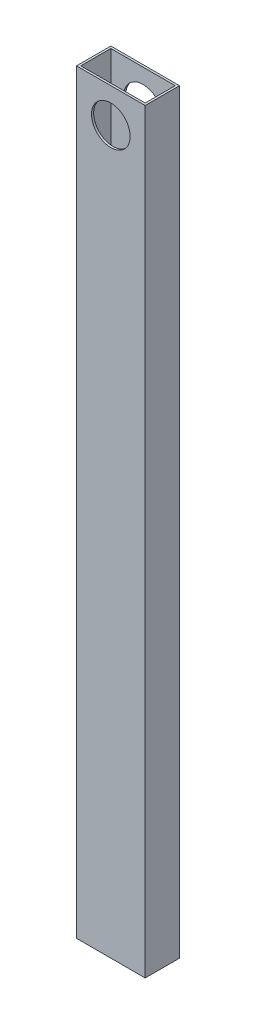
ISO-10303-21;
HEADER;
FILE_DESCRIPTION(('STEP AP214'),'2;1');
FILE_NAME('part.step','',(''),(''),'','','');
FILE_SCHEMA(('AUTOMOTIVE_DESIGN { 1 0 10303 214 1 1 1 1 }'));
ENDSEC;
DATA;
#1=APPLICATION_CONTEXT('core data for automotive mechanical design processes');
#2=APPLICATION_PROTOCOL_DEFINITION('international standard','automotive_design',2000,#1);
#3=PRODUCT_CONTEXT('',#1,'mechanical');
#4=PRODUCT('Part','Part','',(#3));
#5=PRODUCT_RELATED_PRODUCT_CATEGORY('part','',(#4));
#6=PRODUCT_DEFINITION_FORMATION('','',#4);
#7=PRODUCT_DEFINITION_CONTEXT('part definition',#1,'design');
#8=PRODUCT_DEFINITION('design','',#6,#7);
#9=PRODUCT_DEFINITION_SHAPE('','',#8);
#10=(LENGTH_UNIT() NAMED_UNIT(*) SI_UNIT(.MILLI.,.METRE.));
#11=(NAMED_UNIT(*) PLANE_ANGLE_UNIT() SI_UNIT($,.RADIAN.));
#12=(NAMED_UNIT(*) SI_UNIT($,.STERADIAN.) SOLID_ANGLE_UNIT());
#13=UNCERTAINTY_MEASURE_WITH_UNIT(LENGTH_MEASURE(1.E-05),#10,'distance_accuracy_value','');
#14=(GEOMETRIC_REPRESENTATION_CONTEXT(3) GLOBAL_UNCERTAINTY_ASSIGNED_CONTEXT((#13)) GLOBAL_UNIT_ASSIGNED_CONTEXT((#10,
#11,#12)) REPRESENTATION_CONTEXT('',''));
#15=CARTESIAN_POINT('',(0.,0.,0.));
#16=DIRECTION('',(0.,0.,1.));
#17=DIRECTION('',(1.,0.,0.));
#18=AXIS2_PLACEMENT_3D('',#15,#16,#17);
#19=CARTESIAN_POINT('',(88.8999999999999,652.526,-25.4));
#20=DIRECTION('',(0.,1.,0.));
#21=DIRECTION('',(0.,0.,1.));
#22=AXIS2_PLACEMENT_3D('',#19,#20,#21);
#23=PLANE('',#22);
#24=DIRECTION('',(-1.,0.,0.));
#25=VECTOR('',#24,1.);
#26=CARTESIAN_POINT('',(88.8999999999999,652.526,0.));
#27=LINE('',#26,#25);
#28=CARTESIAN_POINT('',(139.7,652.526,0.));
#29=VERTEX_POINT('',#28);
#30=CARTESIAN_POINT('',(88.8999999999999,652.526,0.));
#31=VERTEX_POINT('',#30);
#32=EDGE_CURVE('E147',#29,#31,#27,.T.);
#33=ORIENTED_EDGE('',*,*,#32,.F.);
#34=DIRECTION('',(0.,0.,1.));
#35=VECTOR('',#34,1.);
#36=CARTESIAN_POINT('',(139.7,652.526,-25.4));
#37=LINE('',#36,#35);
#38=CARTESIAN_POINT('',(139.7,652.526,-25.4));
#39=VERTEX_POINT('',#38);
#40=EDGE_CURVE('E50',#39,#29,#37,.T.);
#41=ORIENTED_EDGE('',*,*,#40,.F.);
#42=DIRECTION('',(-1.,0.,0.));
#43=VECTOR('',#42,1.);
#44=CARTESIAN_POINT('',(88.8999999999999,652.526,-25.4));
#45=LINE('',#44,#43);
#46=CARTESIAN_POINT('',(88.8999999999999,652.526,-25.4));
#47=VERTEX_POINT('',#46);
#48=EDGE_CURVE('E153',#39,#47,#45,.T.);
#49=ORIENTED_EDGE('',*,*,#48,.T.);
#50=DIRECTION('',(0.,0.,1.));
#51=VECTOR('',#50,1.);
#52=CARTESIAN_POINT('',(88.8999999999999,652.526,-25.4));
#53=LINE('',#52,#51);
#54=EDGE_CURVE('E11',#47,#31,#53,.T.);
#55=ORIENTED_EDGE('',*,*,#54,.T.);
#56=EDGE_LOOP('',(#33,#41,#49,#55));
#57=FACE_BOUND('',#56,.T.);
#58=DIRECTION('',(0.,0.,1.));
#59=VECTOR('',#58,1.);
#60=CARTESIAN_POINT('',(138.1125,652.526,-25.4));
#61=LINE('',#60,#59);
#62=CARTESIAN_POINT('',(138.1125,652.526,-23.8125));
#63=VERTEX_POINT('',#62);
#64=CARTESIAN_POINT('',(138.1125,652.526,-1.5875));
#65=VERTEX_POINT('',#64);
#66=EDGE_CURVE('E117',#63,#65,#61,.T.);
#67=ORIENTED_EDGE('',*,*,#66,.T.);
#68=DIRECTION('',(-1.,0.,0.));
#69=VECTOR('',#68,1.);
#70=CARTESIAN_POINT('',(0.,652.526,-1.5875));
#71=LINE('',#70,#69);
#72=CARTESIAN_POINT('',(90.4874999999999,652.526,-1.5875));
#73=VERTEX_POINT('',#72);
#74=EDGE_CURVE('E123',#65,#73,#71,.T.);
#75=ORIENTED_EDGE('',*,*,#74,.T.);
#76=DIRECTION('',(0.,0.,1.));
#77=VECTOR('',#76,1.);
#78=CARTESIAN_POINT('',(90.4874999999999,652.526,-25.4));
#79=LINE('',#78,#77);
#80=CARTESIAN_POINT('',(90.4874999999999,652.526,-23.8125));
#81=VERTEX_POINT('',#80);
#82=EDGE_CURVE('E108',#81,#73,#79,.T.);
#83=ORIENTED_EDGE('',*,*,#82,.F.);
#84=DIRECTION('',(-1.,0.,0.));
#85=VECTOR('',#84,1.);
#86=CARTESIAN_POINT('',(0.,652.526,-23.8125));
#87=LINE('',#86,#85);
#88=EDGE_CURVE('E58',#63,#81,#87,.T.);
#89=ORIENTED_EDGE('',*,*,#88,.F.);
#90=EDGE_LOOP('',(#67,#75,#83,#89));
#91=FACE_BOUND('',#90,.T.);
#92=ADVANCED_FACE('F41',(#57,#91),#23,.T.);
#93=CARTESIAN_POINT('',(88.8999999999999,93.726,-25.4));
#94=DIRECTION('',(0.,-1.,0.));
#95=DIRECTION('',(0.,0.,-1.));
#96=AXIS2_PLACEMENT_3D('',#93,#94,#95);
#97=PLANE('',#96);
#98=DIRECTION('',(1.,0.,0.));
#99=VECTOR('',#98,1.);
#100=CARTESIAN_POINT('',(88.8999999999999,93.726,0.));
#101=LINE('',#100,#99);
#102=CARTESIAN_POINT('',(88.8999999999999,93.726,0.));
#103=VERTEX_POINT('',#102);
#104=CARTESIAN_POINT('',(139.7,93.726,0.));
#105=VERTEX_POINT('',#104);
#106=EDGE_CURVE('E159',#103,#105,#101,.T.);
#107=ORIENTED_EDGE('',*,*,#106,.F.);
#108=DIRECTION('',(0.,0.,1.));
#109=VECTOR('',#108,1.);
#110=CARTESIAN_POINT('',(88.8999999999999,93.726,-25.4));
#111=LINE('',#110,#109);
#112=CARTESIAN_POINT('',(88.8999999999999,93.726,-25.4));
#113=VERTEX_POINT('',#112);
#114=EDGE_CURVE('E156',#113,#103,#111,.T.);
#115=ORIENTED_EDGE('',*,*,#114,.F.);
#116=DIRECTION('',(1.,0.,0.));
#117=VECTOR('',#116,1.);
#118=CARTESIAN_POINT('',(88.8999999999999,93.726,-25.4));
#119=LINE('',#118,#117);
#120=CARTESIAN_POINT('',(139.7,93.726,-25.4));
#121=VERTEX_POINT('',#120);
#122=EDGE_CURVE('E146',#113,#121,#119,.T.);
#123=ORIENTED_EDGE('',*,*,#122,.T.);
#124=DIRECTION('',(0.,0.,1.));
#125=VECTOR('',#124,1.);
#126=CARTESIAN_POINT('',(139.7,93.726,-25.4));
#127=LINE('',#126,#125);
#128=EDGE_CURVE('E168',#121,#105,#127,.T.);
#129=ORIENTED_EDGE('',*,*,#128,.T.);
#130=EDGE_LOOP('',(#107,#115,#123,#129));
#131=FACE_BOUND('',#130,.T.);
#132=DIRECTION('',(0.,0.,1.));
#133=VECTOR('',#132,1.);
#134=CARTESIAN_POINT('',(90.4874999999999,93.726,-25.4));
#135=LINE('',#134,#133);
#136=CARTESIAN_POINT('',(90.4874999999999,93.726,-23.8125));
#137=VERTEX_POINT('',#136);
#138=CARTESIAN_POINT('',(90.4874999999999,93.726,-1.5875));
#139=VERTEX_POINT('',#138);
#140=EDGE_CURVE('E137',#137,#139,#135,.T.);
#141=ORIENTED_EDGE('',*,*,#140,.T.);
#142=DIRECTION('',(1.,0.,0.));
#143=VECTOR('',#142,1.);
#144=CARTESIAN_POINT('',(0.,93.726,-1.5875));
#145=LINE('',#144,#143);
#146=CARTESIAN_POINT('',(138.1125,93.726,-1.5875));
#147=VERTEX_POINT('',#146);
#148=EDGE_CURVE('E126',#139,#147,#145,.T.);
#149=ORIENTED_EDGE('',*,*,#148,.T.);
#150=DIRECTION('',(0.,0.,1.));
#151=VECTOR('',#150,1.);
#152=CARTESIAN_POINT('',(138.1125,93.726,-25.4));
#153=LINE('',#152,#151);
#154=CARTESIAN_POINT('',(138.1125,93.726,-23.8125));
#155=VERTEX_POINT('',#154);
#156=EDGE_CURVE('E135',#155,#147,#153,.T.);
#157=ORIENTED_EDGE('',*,*,#156,.F.);
#158=DIRECTION('',(1.,0.,0.));
#159=VECTOR('',#158,1.);
#160=CARTESIAN_POINT('',(0.,93.726,-23.8125));
#161=LINE('',#160,#159);
#162=EDGE_CURVE('E63',#137,#155,#161,.T.);
#163=ORIENTED_EDGE('',*,*,#162,.F.);
#164=EDGE_LOOP('',(#141,#149,#157,#163));
#165=FACE_BOUND('',#164,.T.);
#166=ADVANCED_FACE('F175',(#131,#165),#97,.T.);
#167=CARTESIAN_POINT('',(88.8999999999999,652.526,-25.4));
#168=DIRECTION('',(-1.,0.,0.));
#169=DIRECTION('',(0.,0.,1.));
#170=AXIS2_PLACEMENT_3D('',#167,#168,#169);
#171=PLANE('',#170);
#172=DIRECTION('',(0.,-1.,0.));
#173=VECTOR('',#172,1.);
#174=CARTESIAN_POINT('',(88.8999999999999,652.526,0.));
#175=LINE('',#174,#173);
#176=EDGE_CURVE('E116',#31,#103,#175,.T.);
#177=ORIENTED_EDGE('',*,*,#176,.F.);
#178=ORIENTED_EDGE('',*,*,#54,.F.);
#179=DIRECTION('',(0.,-1.,0.));
#180=VECTOR('',#179,1.);
#181=CARTESIAN_POINT('',(88.8999999999999,652.526,-25.4));
#182=LINE('',#181,#180);
#183=EDGE_CURVE('E143',#47,#113,#182,.T.);
#184=ORIENTED_EDGE('',*,*,#183,.T.);
#185=ORIENTED_EDGE('',*,*,#114,.T.);
#186=EDGE_LOOP('',(#177,#178,#184,#185));
#187=FACE_BOUND('',#186,.T.);
#188=ADVANCED_FACE('F43',(#187),#171,.T.);
#189=CARTESIAN_POINT('',(139.7,652.526,-25.4));
#190=DIRECTION('',(1.,0.,0.));
#191=DIRECTION('',(0.,0.,-1.));
#192=AXIS2_PLACEMENT_3D('',#189,#190,#191);
#193=PLANE('',#192);
#194=DIRECTION('',(0.,1.,0.));
#195=VECTOR('',#194,1.);
#196=CARTESIAN_POINT('',(139.7,652.526,0.));
#197=LINE('',#196,#195);
#198=EDGE_CURVE('E162',#105,#29,#197,.T.);
#199=ORIENTED_EDGE('',*,*,#198,.F.);
#200=ORIENTED_EDGE('',*,*,#128,.F.);
#201=DIRECTION('',(0.,1.,0.));
#202=VECTOR('',#201,1.);
#203=CARTESIAN_POINT('',(139.7,652.526,-25.4));
#204=LINE('',#203,#202);
#205=EDGE_CURVE('E150',#121,#39,#204,.T.);
#206=ORIENTED_EDGE('',*,*,#205,.T.);
#207=ORIENTED_EDGE('',*,*,#40,.T.);
#208=EDGE_LOOP('',(#199,#200,#206,#207));
#209=FACE_BOUND('',#208,.T.);
#210=ADVANCED_FACE('F187',(#209),#193,.T.);
#211=CARTESIAN_POINT('',(0.,0.,-25.4));
#212=DIRECTION('',(0.,0.,1.));
#213=DIRECTION('',(1.,0.,0.));
#214=AXIS2_PLACEMENT_3D('',#211,#212,#213);
#215=PLANE('',#214);
#216=CARTESIAN_POINT('',(114.3,627.126,-25.4));
#217=DIRECTION('',(0.,0.,1.));
#218=DIRECTION('',(1.,0.,0.));
#219=AXIS2_PLACEMENT_3D('',#216,#217,#218);
#220=CIRCLE('',#219,14.2875);
#221=CARTESIAN_POINT('',(128.5875,627.126,-25.4));
#222=VERTEX_POINT('',#221);
#223=EDGE_CURVE('E232',#222,#222,#220,.T.);
#224=ORIENTED_EDGE('',*,*,#223,.T.);
#225=EDGE_LOOP('',(#224));
#226=FACE_BOUND('',#225,.T.);
#227=ORIENTED_EDGE('',*,*,#183,.F.);
#228=ORIENTED_EDGE('',*,*,#48,.F.);
#229=ORIENTED_EDGE('',*,*,#205,.F.);
#230=ORIENTED_EDGE('',*,*,#122,.F.);
#231=EDGE_LOOP('',(#227,#228,#229,#230));
#232=FACE_BOUND('',#231,.T.);
#233=ADVANCED_FACE('F184',(#226,#232),#215,.F.);
#234=CARTESIAN_POINT('',(0.,0.,0.));
#235=DIRECTION('',(0.,0.,1.));
#236=DIRECTION('',(1.,0.,0.));
#237=AXIS2_PLACEMENT_3D('',#234,#235,#236);
#238=PLANE('',#237);
#239=CARTESIAN_POINT('',(114.3,627.126,0.));
#240=DIRECTION('',(0.,0.,1.));
#241=DIRECTION('',(1.,0.,0.));
#242=AXIS2_PLACEMENT_3D('',#239,#240,#241);
#243=CIRCLE('',#242,14.2875);
#244=CARTESIAN_POINT('',(128.5875,627.126,0.));
#245=VERTEX_POINT('',#244);
#246=EDGE_CURVE('E127',#245,#245,#243,.T.);
#247=ORIENTED_EDGE('',*,*,#246,.F.);
#248=EDGE_LOOP('',(#247));
#249=FACE_BOUND('',#248,.T.);
#250=ORIENTED_EDGE('',*,*,#176,.T.);
#251=ORIENTED_EDGE('',*,*,#106,.T.);
#252=ORIENTED_EDGE('',*,*,#198,.T.);
#253=ORIENTED_EDGE('',*,*,#32,.T.);
#254=EDGE_LOOP('',(#250,#251,#252,#253));
#255=FACE_BOUND('',#254,.T.);
#256=ADVANCED_FACE('F179',(#249,#255),#238,.T.);
#257=CARTESIAN_POINT('',(90.4874999999999,652.526,-25.4));
#258=DIRECTION('',(-1.,0.,0.));
#259=DIRECTION('',(0.,0.,1.));
#260=AXIS2_PLACEMENT_3D('',#257,#258,#259);
#261=PLANE('',#260);
#262=DIRECTION('',(0.,-1.,0.));
#263=VECTOR('',#262,1.);
#264=CARTESIAN_POINT('',(90.4874999999999,0.,-1.5875));
#265=LINE('',#264,#263);
#266=EDGE_CURVE('E111',#73,#139,#265,.T.);
#267=ORIENTED_EDGE('',*,*,#266,.T.);
#268=ORIENTED_EDGE('',*,*,#140,.F.);
#269=DIRECTION('',(0.,-1.,0.));
#270=VECTOR('',#269,1.);
#271=CARTESIAN_POINT('',(90.4874999999999,0.,-23.8125));
#272=LINE('',#271,#270);
#273=EDGE_CURVE('E113',#81,#137,#272,.T.);
#274=ORIENTED_EDGE('',*,*,#273,.F.);
#275=ORIENTED_EDGE('',*,*,#82,.T.);
#276=EDGE_LOOP('',(#267,#268,#274,#275));
#277=FACE_BOUND('',#276,.T.);
#278=ADVANCED_FACE('F110',(#277),#261,.F.);
#279=CARTESIAN_POINT('',(138.1125,652.526,-25.4));
#280=DIRECTION('',(1.,0.,0.));
#281=DIRECTION('',(0.,0.,-1.));
#282=AXIS2_PLACEMENT_3D('',#279,#280,#281);
#283=PLANE('',#282);
#284=DIRECTION('',(0.,1.,0.));
#285=VECTOR('',#284,1.);
#286=CARTESIAN_POINT('',(138.1125,0.,-1.5875));
#287=LINE('',#286,#285);
#288=EDGE_CURVE('E129',#147,#65,#287,.T.);
#289=ORIENTED_EDGE('',*,*,#288,.T.);
#290=ORIENTED_EDGE('',*,*,#66,.F.);
#291=DIRECTION('',(0.,1.,0.));
#292=VECTOR('',#291,1.);
#293=CARTESIAN_POINT('',(138.1125,0.,-23.8125));
#294=LINE('',#293,#292);
#295=EDGE_CURVE('E138',#155,#63,#294,.T.);
#296=ORIENTED_EDGE('',*,*,#295,.F.);
#297=ORIENTED_EDGE('',*,*,#156,.T.);
#298=EDGE_LOOP('',(#289,#290,#296,#297));
#299=FACE_BOUND('',#298,.T.);
#300=ADVANCED_FACE('F212',(#299),#283,.F.);
#301=CARTESIAN_POINT('',(0.,0.,-23.8125));
#302=DIRECTION('',(0.,0.,1.));
#303=DIRECTION('',(1.,0.,0.));
#304=AXIS2_PLACEMENT_3D('',#301,#302,#303);
#305=PLANE('',#304);
#306=CARTESIAN_POINT('',(114.3,627.126,-23.8125));
#307=DIRECTION('',(0.,0.,1.));
#308=DIRECTION('',(1.,0.,0.));
#309=AXIS2_PLACEMENT_3D('',#306,#307,#308);
#310=CIRCLE('',#309,14.2875);
#311=CARTESIAN_POINT('',(128.5875,627.126,-23.8125));
#312=VERTEX_POINT('',#311);
#313=EDGE_CURVE('E229',#312,#312,#310,.T.);
#314=ORIENTED_EDGE('',*,*,#313,.F.);
#315=EDGE_LOOP('',(#314));
#316=FACE_BOUND('',#315,.T.);
#317=ORIENTED_EDGE('',*,*,#273,.T.);
#318=ORIENTED_EDGE('',*,*,#162,.T.);
#319=ORIENTED_EDGE('',*,*,#295,.T.);
#320=ORIENTED_EDGE('',*,*,#88,.T.);
#321=EDGE_LOOP('',(#317,#318,#319,#320));
#322=FACE_BOUND('',#321,.T.);
#323=ADVANCED_FACE('F208',(#316,#322),#305,.T.);
#324=CARTESIAN_POINT('',(0.,0.,-1.5875));
#325=DIRECTION('',(0.,0.,1.));
#326=DIRECTION('',(1.,0.,0.));
#327=AXIS2_PLACEMENT_3D('',#324,#325,#326);
#328=PLANE('',#327);
#329=CARTESIAN_POINT('',(114.3,627.126,-1.5875));
#330=DIRECTION('',(0.,0.,1.));
#331=DIRECTION('',(1.,0.,0.));
#332=AXIS2_PLACEMENT_3D('',#329,#330,#331);
#333=CIRCLE('',#332,14.2875);
#334=CARTESIAN_POINT('',(128.5875,627.126,-1.5875));
#335=VERTEX_POINT('',#334);
#336=EDGE_CURVE('E45',#335,#335,#333,.T.);
#337=ORIENTED_EDGE('',*,*,#336,.T.);
#338=EDGE_LOOP('',(#337));
#339=FACE_BOUND('',#338,.T.);
#340=ORIENTED_EDGE('',*,*,#266,.F.);
#341=ORIENTED_EDGE('',*,*,#74,.F.);
#342=ORIENTED_EDGE('',*,*,#288,.F.);
#343=ORIENTED_EDGE('',*,*,#148,.F.);
#344=EDGE_LOOP('',(#340,#341,#342,#343));
#345=FACE_BOUND('',#344,.T.);
#346=ADVANCED_FACE('F121',(#339,#345),#328,.F.);
#347=CARTESIAN_POINT('',(114.3,627.126,-25.4));
#348=DIRECTION('',(0.,0.,1.));
#349=DIRECTION('',(1.,0.,0.));
#350=AXIS2_PLACEMENT_3D('',#347,#348,#349);
#351=CYLINDRICAL_SURFACE('',#350,14.2875);
#352=ORIENTED_EDGE('',*,*,#246,.T.);
#353=EDGE_LOOP('',(#352));
#354=FACE_BOUND('',#353,.T.);
#355=ORIENTED_EDGE('',*,*,#336,.F.);
#356=EDGE_LOOP('',(#355));
#357=FACE_BOUND('',#356,.T.);
#358=ADVANCED_FACE('F207',(#354,#357),#351,.F.);
#359=ORIENTED_EDGE('',*,*,#313,.T.);
#360=EDGE_LOOP('',(#359));
#361=FACE_BOUND('',#360,.T.);
#362=ORIENTED_EDGE('',*,*,#223,.F.);
#363=EDGE_LOOP('',(#362));
#364=FACE_BOUND('',#363,.T.);
#365=ADVANCED_FACE('F219',(#361,#364),#351,.F.);
#366=CLOSED_SHELL('',(#92,#166,#188,#210,#233,#256,#278,#300,#323,#346,#358,#365));
#367=MANIFOLD_SOLID_BREP('B2',#366);
#368=ADVANCED_BREP_SHAPE_REPRESENTATION('',(#18,#367),#14);
#369=SHAPE_DEFINITION_REPRESENTATION(#9,#368);
ENDSEC;
END-ISO-10303-21;
